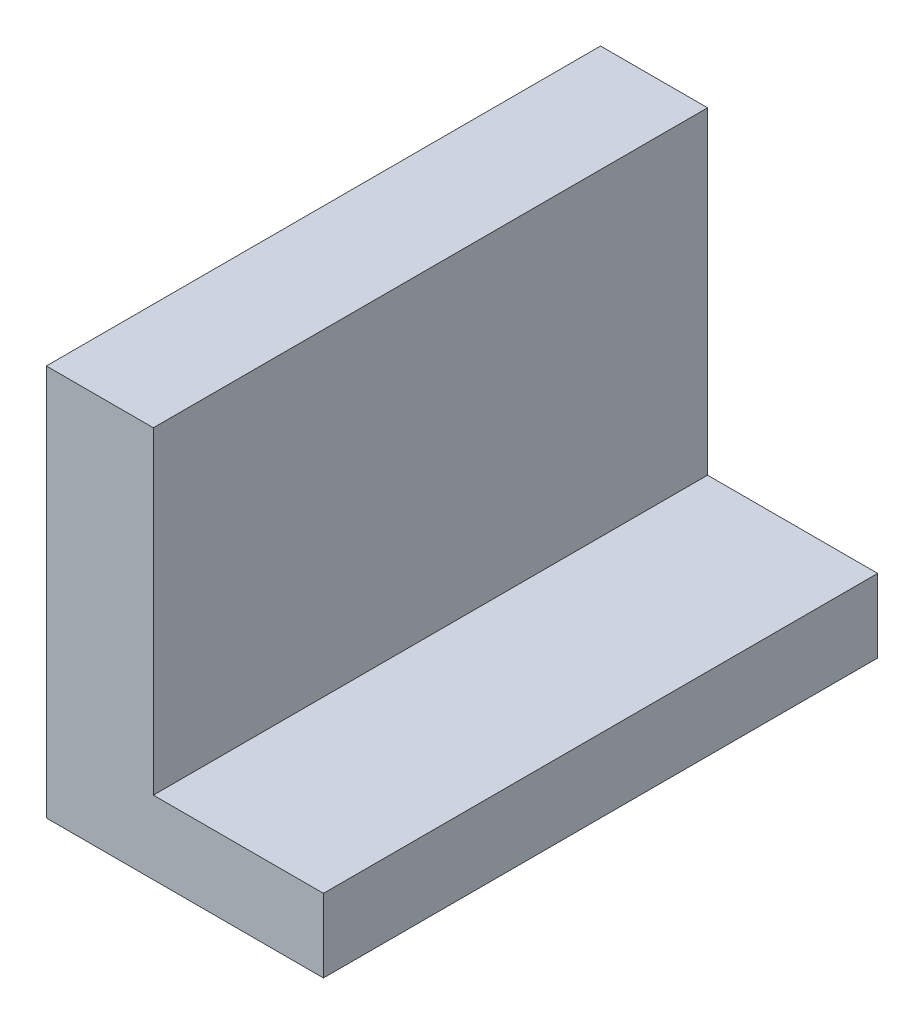
ISO-10303-21;
HEADER;
FILE_DESCRIPTION(('STEP AP214'),'2;1');
FILE_NAME('part.step','',(''),(''),'','','');
FILE_SCHEMA(('AUTOMOTIVE_DESIGN { 1 0 10303 214 1 1 1 1 }'));
ENDSEC;
DATA;
#1=APPLICATION_CONTEXT('core data for automotive mechanical design processes');
#2=APPLICATION_PROTOCOL_DEFINITION('international standard','automotive_design',2000,#1);
#3=PRODUCT_CONTEXT('',#1,'mechanical');
#4=PRODUCT('Part','Part','',(#3));
#5=PRODUCT_RELATED_PRODUCT_CATEGORY('part','',(#4));
#6=PRODUCT_DEFINITION_FORMATION('','',#4);
#7=PRODUCT_DEFINITION_CONTEXT('part definition',#1,'design');
#8=PRODUCT_DEFINITION('design','',#6,#7);
#9=PRODUCT_DEFINITION_SHAPE('','',#8);
#10=(LENGTH_UNIT() NAMED_UNIT(*) SI_UNIT(.MILLI.,.METRE.));
#11=(NAMED_UNIT(*) PLANE_ANGLE_UNIT() SI_UNIT($,.RADIAN.));
#12=(NAMED_UNIT(*) SI_UNIT($,.STERADIAN.) SOLID_ANGLE_UNIT());
#13=UNCERTAINTY_MEASURE_WITH_UNIT(LENGTH_MEASURE(1.E-05),#10,'distance_accuracy_value','');
#14=(GEOMETRIC_REPRESENTATION_CONTEXT(3) GLOBAL_UNCERTAINTY_ASSIGNED_CONTEXT((#13)) GLOBAL_UNIT_ASSIGNED_CONTEXT((#10,
#11,#12)) REPRESENTATION_CONTEXT('',''));
#15=CARTESIAN_POINT('',(0.,0.,0.));
#16=DIRECTION('',(0.,0.,1.));
#17=DIRECTION('',(1.,0.,0.));
#18=AXIS2_PLACEMENT_3D('',#15,#16,#17);
#19=CARTESIAN_POINT('',(0.,84.7619047619048,120.));
#20=DIRECTION('',(1.,0.,0.));
#21=DIRECTION('',(0.,0.,-1.));
#22=AXIS2_PLACEMENT_3D('',#19,#20,#21);
#23=PLANE('',#22);
#24=DIRECTION('',(0.,-1.,0.));
#25=VECTOR('',#24,1.);
#26=CARTESIAN_POINT('',(0.,84.7619047619048,0.));
#27=LINE('',#26,#25);
#28=CARTESIAN_POINT('',(0.,84.7619047619048,0.));
#29=VERTEX_POINT('',#28);
#30=CARTESIAN_POINT('',(0.,0.,0.));
#31=VERTEX_POINT('',#30);
#32=EDGE_CURVE('E134',#29,#31,#27,.T.);
#33=ORIENTED_EDGE('',*,*,#32,.T.);
#34=DIRECTION('',(0.,0.,-1.));
#35=VECTOR('',#34,1.);
#36=CARTESIAN_POINT('',(0.,0.,120.));
#37=LINE('',#36,#35);
#38=CARTESIAN_POINT('',(0.,0.,120.));
#39=VERTEX_POINT('',#38);
#40=EDGE_CURVE('E11',#39,#31,#37,.T.);
#41=ORIENTED_EDGE('',*,*,#40,.F.);
#42=DIRECTION('',(0.,-1.,0.));
#43=VECTOR('',#42,1.);
#44=CARTESIAN_POINT('',(0.,84.7619047619048,120.));
#45=LINE('',#44,#43);
#46=CARTESIAN_POINT('',(0.,84.7619047619048,120.));
#47=VERTEX_POINT('',#46);
#48=EDGE_CURVE('E150',#47,#39,#45,.T.);
#49=ORIENTED_EDGE('',*,*,#48,.F.);
#50=DIRECTION('',(0.,0.,-1.));
#51=VECTOR('',#50,1.);
#52=CARTESIAN_POINT('',(0.,84.7619047619048,120.));
#53=LINE('',#52,#51);
#54=EDGE_CURVE('E130',#47,#29,#53,.T.);
#55=ORIENTED_EDGE('',*,*,#54,.T.);
#56=EDGE_LOOP('',(#33,#41,#49,#55));
#57=FACE_BOUND('',#56,.T.);
#58=ADVANCED_FACE('F45',(#57),#23,.F.);
#59=CARTESIAN_POINT('',(0.,0.,120.));
#60=DIRECTION('',(0.,1.,0.));
#61=DIRECTION('',(0.,0.,1.));
#62=AXIS2_PLACEMENT_3D('',#59,#60,#61);
#63=PLANE('',#62);
#64=DIRECTION('',(1.,0.,0.));
#65=VECTOR('',#64,1.);
#66=CARTESIAN_POINT('',(0.,0.,0.));
#67=LINE('',#66,#65);
#68=CARTESIAN_POINT('',(60.,0.,0.));
#69=VERTEX_POINT('',#68);
#70=EDGE_CURVE('E138',#31,#69,#67,.T.);
#71=ORIENTED_EDGE('',*,*,#70,.T.);
#72=DIRECTION('',(0.,0.,-1.));
#73=VECTOR('',#72,1.);
#74=CARTESIAN_POINT('',(60.,0.,120.));
#75=LINE('',#74,#73);
#76=CARTESIAN_POINT('',(60.,0.,120.));
#77=VERTEX_POINT('',#76);
#78=EDGE_CURVE('E54',#77,#69,#75,.T.);
#79=ORIENTED_EDGE('',*,*,#78,.F.);
#80=DIRECTION('',(1.,0.,0.));
#81=VECTOR('',#80,1.);
#82=CARTESIAN_POINT('',(0.,0.,120.));
#83=LINE('',#82,#81);
#84=EDGE_CURVE('E99',#39,#77,#83,.T.);
#85=ORIENTED_EDGE('',*,*,#84,.F.);
#86=ORIENTED_EDGE('',*,*,#40,.T.);
#87=EDGE_LOOP('',(#71,#79,#85,#86));
#88=FACE_BOUND('',#87,.T.);
#89=ADVANCED_FACE('F178',(#88),#63,.F.);
#90=CARTESIAN_POINT('',(60.,0.,120.));
#91=DIRECTION('',(-1.,0.,0.));
#92=DIRECTION('',(0.,0.,1.));
#93=AXIS2_PLACEMENT_3D('',#90,#91,#92);
#94=PLANE('',#93);
#95=DIRECTION('',(0.,1.,0.));
#96=VECTOR('',#95,1.);
#97=CARTESIAN_POINT('',(60.,0.,0.));
#98=LINE('',#97,#96);
#99=CARTESIAN_POINT('',(60.,15.8730158730159,0.));
#100=VERTEX_POINT('',#99);
#101=EDGE_CURVE('E141',#69,#100,#98,.T.);
#102=ORIENTED_EDGE('',*,*,#101,.T.);
#103=DIRECTION('',(0.,0.,-1.));
#104=VECTOR('',#103,1.);
#105=CARTESIAN_POINT('',(60.,15.8730158730159,120.));
#106=LINE('',#105,#104);
#107=CARTESIAN_POINT('',(60.,15.8730158730159,120.));
#108=VERTEX_POINT('',#107);
#109=EDGE_CURVE('E123',#108,#100,#106,.T.);
#110=ORIENTED_EDGE('',*,*,#109,.F.);
#111=DIRECTION('',(0.,1.,0.));
#112=VECTOR('',#111,1.);
#113=CARTESIAN_POINT('',(60.,0.,120.));
#114=LINE('',#113,#112);
#115=EDGE_CURVE('E112',#77,#108,#114,.T.);
#116=ORIENTED_EDGE('',*,*,#115,.F.);
#117=ORIENTED_EDGE('',*,*,#78,.T.);
#118=EDGE_LOOP('',(#102,#110,#116,#117));
#119=FACE_BOUND('',#118,.T.);
#120=ADVANCED_FACE('F160',(#119),#94,.F.);
#121=CARTESIAN_POINT('',(60.,15.8730158730159,120.));
#122=DIRECTION('',(0.,-1.,0.));
#123=DIRECTION('',(0.,0.,-1.));
#124=AXIS2_PLACEMENT_3D('',#121,#122,#123);
#125=PLANE('',#124);
#126=DIRECTION('',(-1.,0.,0.));
#127=VECTOR('',#126,1.);
#128=CARTESIAN_POINT('',(60.,15.8730158730159,0.));
#129=LINE('',#128,#127);
#130=CARTESIAN_POINT('',(23.1746031746032,15.8730158730159,0.));
#131=VERTEX_POINT('',#130);
#132=EDGE_CURVE('E121',#100,#131,#129,.T.);
#133=ORIENTED_EDGE('',*,*,#132,.T.);
#134=DIRECTION('',(0.,0.,-1.));
#135=VECTOR('',#134,1.);
#136=CARTESIAN_POINT('',(23.1746031746032,15.8730158730159,120.));
#137=LINE('',#136,#135);
#138=CARTESIAN_POINT('',(23.1746031746032,15.8730158730159,120.));
#139=VERTEX_POINT('',#138);
#140=EDGE_CURVE('E118',#139,#131,#137,.T.);
#141=ORIENTED_EDGE('',*,*,#140,.F.);
#142=DIRECTION('',(-1.,0.,0.));
#143=VECTOR('',#142,1.);
#144=CARTESIAN_POINT('',(60.,15.8730158730159,120.));
#145=LINE('',#144,#143);
#146=EDGE_CURVE('E106',#108,#139,#145,.T.);
#147=ORIENTED_EDGE('',*,*,#146,.F.);
#148=ORIENTED_EDGE('',*,*,#109,.T.);
#149=EDGE_LOOP('',(#133,#141,#147,#148));
#150=FACE_BOUND('',#149,.T.);
#151=ADVANCED_FACE('F119',(#150),#125,.F.);
#152=CARTESIAN_POINT('',(23.1746031746032,15.8730158730159,120.));
#153=DIRECTION('',(-1.,0.,0.));
#154=DIRECTION('',(0.,0.,1.));
#155=AXIS2_PLACEMENT_3D('',#152,#153,#154);
#156=PLANE('',#155);
#157=DIRECTION('',(0.,1.,0.));
#158=VECTOR('',#157,1.);
#159=CARTESIAN_POINT('',(23.1746031746032,15.8730158730159,0.));
#160=LINE('',#159,#158);
#161=CARTESIAN_POINT('',(23.1746031746032,84.7619047619048,0.));
#162=VERTEX_POINT('',#161);
#163=EDGE_CURVE('E85',#131,#162,#160,.T.);
#164=ORIENTED_EDGE('',*,*,#163,.T.);
#165=DIRECTION('',(0.,0.,-1.));
#166=VECTOR('',#165,1.);
#167=CARTESIAN_POINT('',(23.1746031746032,84.7619047619048,120.));
#168=LINE('',#167,#166);
#169=CARTESIAN_POINT('',(23.1746031746032,84.7619047619048,120.));
#170=VERTEX_POINT('',#169);
#171=EDGE_CURVE('E124',#170,#162,#168,.T.);
#172=ORIENTED_EDGE('',*,*,#171,.F.);
#173=DIRECTION('',(0.,1.,0.));
#174=VECTOR('',#173,1.);
#175=CARTESIAN_POINT('',(23.1746031746032,15.8730158730159,120.));
#176=LINE('',#175,#174);
#177=EDGE_CURVE('E110',#139,#170,#176,.T.);
#178=ORIENTED_EDGE('',*,*,#177,.F.);
#179=ORIENTED_EDGE('',*,*,#140,.T.);
#180=EDGE_LOOP('',(#164,#172,#178,#179));
#181=FACE_BOUND('',#180,.T.);
#182=ADVANCED_FACE('F126',(#181),#156,.F.);
#183=CARTESIAN_POINT('',(23.1746031746032,84.7619047619048,120.));
#184=DIRECTION('',(0.,-1.,0.));
#185=DIRECTION('',(0.,0.,-1.));
#186=AXIS2_PLACEMENT_3D('',#183,#184,#185);
#187=PLANE('',#186);
#188=DIRECTION('',(-1.,0.,0.));
#189=VECTOR('',#188,1.);
#190=CARTESIAN_POINT('',(23.1746031746032,84.7619047619048,0.));
#191=LINE('',#190,#189);
#192=EDGE_CURVE('E91',#162,#29,#191,.T.);
#193=ORIENTED_EDGE('',*,*,#192,.T.);
#194=ORIENTED_EDGE('',*,*,#54,.F.);
#195=DIRECTION('',(-1.,0.,0.));
#196=VECTOR('',#195,1.);
#197=CARTESIAN_POINT('',(23.1746031746032,84.7619047619048,120.));
#198=LINE('',#197,#196);
#199=EDGE_CURVE('E62',#170,#47,#198,.T.);
#200=ORIENTED_EDGE('',*,*,#199,.F.);
#201=ORIENTED_EDGE('',*,*,#171,.T.);
#202=EDGE_LOOP('',(#193,#194,#200,#201));
#203=FACE_BOUND('',#202,.T.);
#204=ADVANCED_FACE('F167',(#203),#187,.F.);
#205=CARTESIAN_POINT('',(0.,0.,120.));
#206=DIRECTION('',(0.,0.,1.));
#207=DIRECTION('',(1.,0.,0.));
#208=AXIS2_PLACEMENT_3D('',#205,#206,#207);
#209=PLANE('',#208);
#210=ORIENTED_EDGE('',*,*,#48,.T.);
#211=ORIENTED_EDGE('',*,*,#84,.T.);
#212=ORIENTED_EDGE('',*,*,#115,.T.);
#213=ORIENTED_EDGE('',*,*,#146,.T.);
#214=ORIENTED_EDGE('',*,*,#177,.T.);
#215=ORIENTED_EDGE('',*,*,#199,.T.);
#216=EDGE_LOOP('',(#210,#211,#212,#213,#214,#215));
#217=FACE_BOUND('',#216,.T.);
#218=ADVANCED_FACE('F108',(#217),#209,.T.);
#219=CARTESIAN_POINT('',(0.,0.,0.));
#220=DIRECTION('',(0.,0.,1.));
#221=DIRECTION('',(1.,0.,0.));
#222=AXIS2_PLACEMENT_3D('',#219,#220,#221);
#223=PLANE('',#222);
#224=ORIENTED_EDGE('',*,*,#32,.F.);
#225=ORIENTED_EDGE('',*,*,#192,.F.);
#226=ORIENTED_EDGE('',*,*,#163,.F.);
#227=ORIENTED_EDGE('',*,*,#132,.F.);
#228=ORIENTED_EDGE('',*,*,#101,.F.);
#229=ORIENTED_EDGE('',*,*,#70,.F.);
#230=EDGE_LOOP('',(#224,#225,#226,#227,#228,#229));
#231=FACE_BOUND('',#230,.T.);
#232=ADVANCED_FACE('F163',(#231),#223,.F.);
#233=CLOSED_SHELL('',(#58,#89,#120,#151,#182,#204,#218,#232));
#234=MANIFOLD_SOLID_BREP('B2',#233);
#235=ADVANCED_BREP_SHAPE_REPRESENTATION('',(#18,#234),#14);
#236=SHAPE_DEFINITION_REPRESENTATION(#9,#235);
ENDSEC;
END-ISO-10303-21;
